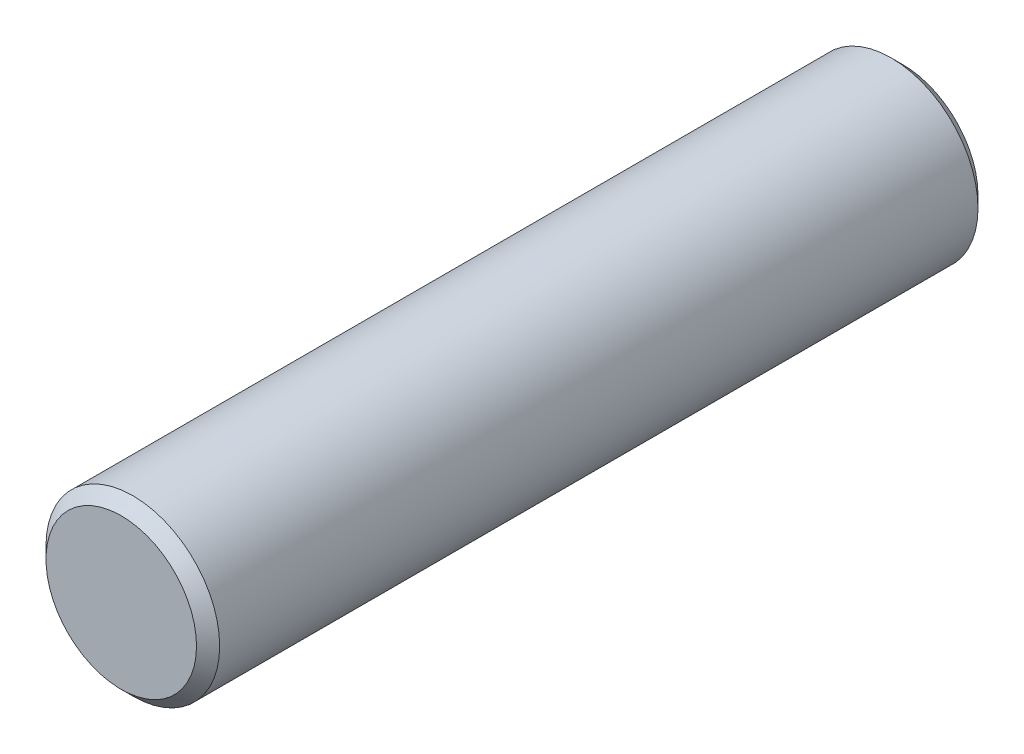
ISO-10303-21;
HEADER;
FILE_DESCRIPTION(('STEP AP214'),'2;1');
FILE_NAME('part.step','',(''),(''),'','','');
FILE_SCHEMA(('AUTOMOTIVE_DESIGN { 1 0 10303 214 1 1 1 1 }'));
ENDSEC;
DATA;
#1=APPLICATION_CONTEXT('core data for automotive mechanical design processes');
#2=APPLICATION_PROTOCOL_DEFINITION('international standard','automotive_design',2000,#1);
#3=PRODUCT_CONTEXT('',#1,'mechanical');
#4=PRODUCT('Part','Part','',(#3));
#5=PRODUCT_RELATED_PRODUCT_CATEGORY('part','',(#4));
#6=PRODUCT_DEFINITION_FORMATION('','',#4);
#7=PRODUCT_DEFINITION_CONTEXT('part definition',#1,'design');
#8=PRODUCT_DEFINITION('design','',#6,#7);
#9=PRODUCT_DEFINITION_SHAPE('','',#8);
#10=(LENGTH_UNIT() NAMED_UNIT(*) SI_UNIT(.MILLI.,.METRE.));
#11=(NAMED_UNIT(*) PLANE_ANGLE_UNIT() SI_UNIT($,.RADIAN.));
#12=(NAMED_UNIT(*) SI_UNIT($,.STERADIAN.) SOLID_ANGLE_UNIT());
#13=UNCERTAINTY_MEASURE_WITH_UNIT(LENGTH_MEASURE(1.E-05),#10,'distance_accuracy_value','');
#14=(GEOMETRIC_REPRESENTATION_CONTEXT(3) GLOBAL_UNCERTAINTY_ASSIGNED_CONTEXT((#13)) GLOBAL_UNIT_ASSIGNED_CONTEXT((#10,
#11,#12)) REPRESENTATION_CONTEXT('',''));
#15=CARTESIAN_POINT('',(0.,0.,0.));
#16=DIRECTION('',(0.,0.,1.));
#17=DIRECTION('',(1.,0.,0.));
#18=AXIS2_PLACEMENT_3D('',#15,#16,#17);
#19=CARTESIAN_POINT('',(0.,0.,-6.75));
#20=DIRECTION('',(0.,0.,1.));
#21=DIRECTION('',(1.,0.,0.));
#22=AXIS2_PLACEMENT_3D('',#19,#20,#21);
#23=CYLINDRICAL_SURFACE('',#22,1.5);
#24=CARTESIAN_POINT('',(0.,0.,-6.55));
#25=DIRECTION('',(0.,0.,1.));
#26=DIRECTION('',(1.,0.,0.));
#27=AXIS2_PLACEMENT_3D('',#24,#25,#26);
#28=CIRCLE('',#27,1.5);
#29=CARTESIAN_POINT('',(1.5,0.,-6.55));
#30=VERTEX_POINT('',#29);
#31=EDGE_CURVE('E52',#30,#30,#28,.T.);
#32=ORIENTED_EDGE('',*,*,#31,.T.);
#33=EDGE_LOOP('',(#32));
#34=FACE_BOUND('',#33,.T.);
#35=CARTESIAN_POINT('',(0.,0.,6.55));
#36=DIRECTION('',(0.,0.,1.));
#37=DIRECTION('',(1.,0.,0.));
#38=AXIS2_PLACEMENT_3D('',#35,#36,#37);
#39=CIRCLE('',#38,1.5);
#40=CARTESIAN_POINT('',(1.5,0.,6.55));
#41=VERTEX_POINT('',#40);
#42=EDGE_CURVE('E57',#41,#41,#39,.F.);
#43=ORIENTED_EDGE('',*,*,#42,.T.);
#44=EDGE_LOOP('',(#43));
#45=FACE_BOUND('',#44,.T.);
#46=ADVANCED_FACE('F43',(#34,#45),#23,.T.);
#47=CARTESIAN_POINT('',(0.,0.,-6.75));
#48=DIRECTION('',(0.,0.,1.));
#49=DIRECTION('',(1.,0.,0.));
#50=AXIS2_PLACEMENT_3D('',#47,#48,#49);
#51=PLANE('',#50);
#52=CARTESIAN_POINT('',(0.,0.,-6.75));
#53=DIRECTION('',(0.,0.,1.));
#54=DIRECTION('',(1.,0.,0.));
#55=AXIS2_PLACEMENT_3D('',#52,#53,#54);
#56=CIRCLE('',#55,1.3);
#57=CARTESIAN_POINT('',(1.3,0.,-6.75));
#58=VERTEX_POINT('',#57);
#59=EDGE_CURVE('E10',#58,#58,#56,.F.);
#60=ORIENTED_EDGE('',*,*,#59,.T.);
#61=EDGE_LOOP('',(#60));
#62=FACE_BOUND('',#61,.T.);
#63=ADVANCED_FACE('F79',(#62),#51,.F.);
#64=CARTESIAN_POINT('',(0.,0.,6.75));
#65=DIRECTION('',(0.,0.,1.));
#66=DIRECTION('',(1.,0.,0.));
#67=AXIS2_PLACEMENT_3D('',#64,#65,#66);
#68=PLANE('',#67);
#69=CARTESIAN_POINT('',(0.,0.,6.75));
#70=DIRECTION('',(0.,0.,1.));
#71=DIRECTION('',(1.,0.,0.));
#72=AXIS2_PLACEMENT_3D('',#69,#70,#71);
#73=CIRCLE('',#72,1.3);
#74=CARTESIAN_POINT('',(1.3,0.,6.75));
#75=VERTEX_POINT('',#74);
#76=EDGE_CURVE('E62',#75,#75,#73,.T.);
#77=ORIENTED_EDGE('',*,*,#76,.T.);
#78=EDGE_LOOP('',(#77));
#79=FACE_BOUND('',#78,.T.);
#80=ADVANCED_FACE('F69',(#79),#68,.T.);
#81=CARTESIAN_POINT('',(0.,0.,6.75));
#82=DIRECTION('',(0.,0.,-1.));
#83=DIRECTION('',(-1.,0.,0.));
#84=AXIS2_PLACEMENT_3D('',#81,#82,#83);
#85=CONICAL_SURFACE('',#84,1.3,0.785398163397445);
#86=ORIENTED_EDGE('',*,*,#42,.F.);
#87=EDGE_LOOP('',(#86));
#88=FACE_BOUND('',#87,.T.);
#89=ORIENTED_EDGE('',*,*,#76,.F.);
#90=EDGE_LOOP('',(#89));
#91=FACE_BOUND('',#90,.T.);
#92=ADVANCED_FACE('F71',(#88,#91),#85,.T.);
#93=CARTESIAN_POINT('',(0.,0.,-6.55));
#94=DIRECTION('',(0.,0.,1.));
#95=DIRECTION('',(1.,0.,0.));
#96=AXIS2_PLACEMENT_3D('',#93,#94,#95);
#97=CONICAL_SURFACE('',#96,1.5,0.785398163397455);
#98=ORIENTED_EDGE('',*,*,#59,.F.);
#99=EDGE_LOOP('',(#98));
#100=FACE_BOUND('',#99,.T.);
#101=ORIENTED_EDGE('',*,*,#31,.F.);
#102=EDGE_LOOP('',(#101));
#103=FACE_BOUND('',#102,.T.);
#104=ADVANCED_FACE('F46',(#100,#103),#97,.T.);
#105=CLOSED_SHELL('',(#46,#63,#80,#92,#104));
#106=MANIFOLD_SOLID_BREP('B2',#105);
#107=ADVANCED_BREP_SHAPE_REPRESENTATION('',(#18,#106),#14);
#108=SHAPE_DEFINITION_REPRESENTATION(#9,#107);
ENDSEC;
END-ISO-10303-21;
